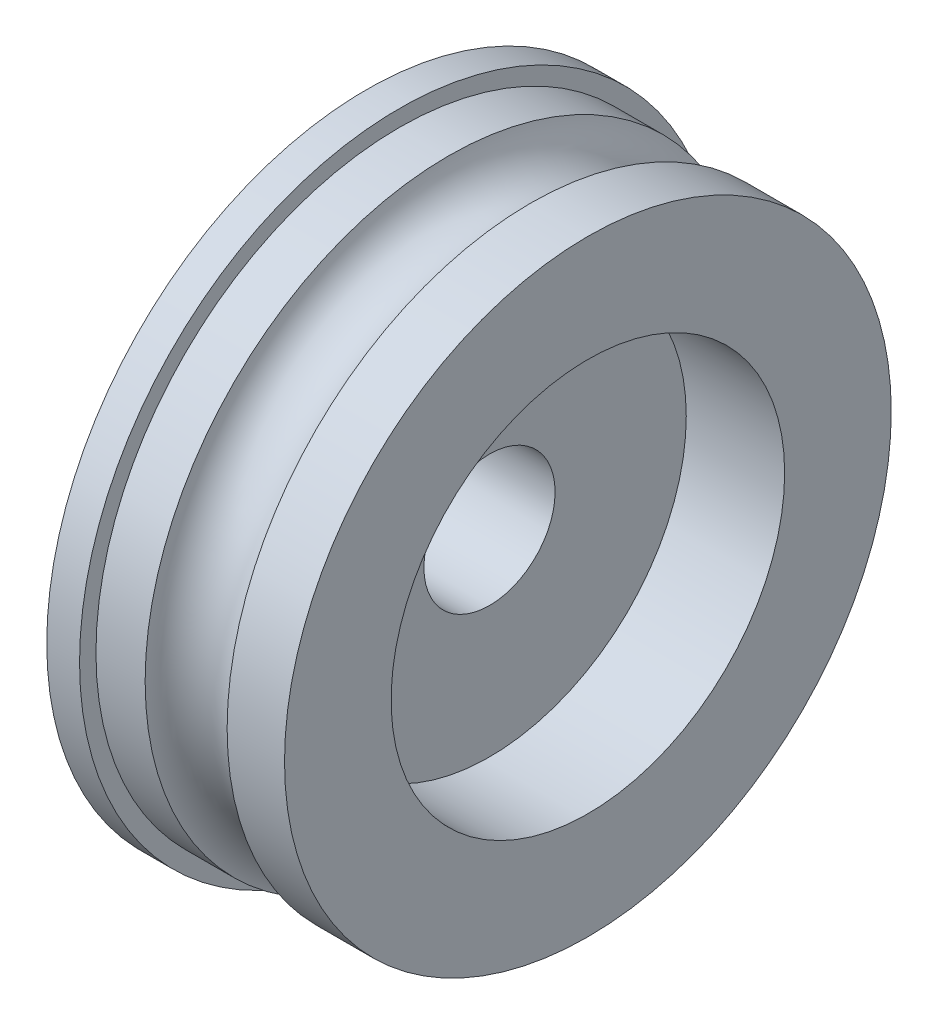
ISO-10303-21;
HEADER;
FILE_DESCRIPTION(('STEP AP214'),'2;1');
FILE_NAME('part.step','',(''),(''),'','','');
FILE_SCHEMA(('AUTOMOTIVE_DESIGN { 1 0 10303 214 1 1 1 1 }'));
ENDSEC;
DATA;
#1=APPLICATION_CONTEXT('core data for automotive mechanical design processes');
#2=APPLICATION_PROTOCOL_DEFINITION('international standard','automotive_design',2000,#1);
#3=PRODUCT_CONTEXT('',#1,'mechanical');
#4=PRODUCT('Part','Part','',(#3));
#5=PRODUCT_RELATED_PRODUCT_CATEGORY('part','',(#4));
#6=PRODUCT_DEFINITION_FORMATION('','',#4);
#7=PRODUCT_DEFINITION_CONTEXT('part definition',#1,'design');
#8=PRODUCT_DEFINITION('design','',#6,#7);
#9=PRODUCT_DEFINITION_SHAPE('','',#8);
#10=(LENGTH_UNIT() NAMED_UNIT(*) SI_UNIT(.MILLI.,.METRE.));
#11=(NAMED_UNIT(*) PLANE_ANGLE_UNIT() SI_UNIT($,.RADIAN.));
#12=(NAMED_UNIT(*) SI_UNIT($,.STERADIAN.) SOLID_ANGLE_UNIT());
#13=UNCERTAINTY_MEASURE_WITH_UNIT(LENGTH_MEASURE(1.E-05),#10,'distance_accuracy_value','');
#14=(GEOMETRIC_REPRESENTATION_CONTEXT(3) GLOBAL_UNCERTAINTY_ASSIGNED_CONTEXT((#13)) GLOBAL_UNIT_ASSIGNED_CONTEXT((#10,
#11,#12)) REPRESENTATION_CONTEXT('',''));
#15=CARTESIAN_POINT('',(0.,0.,0.));
#16=DIRECTION('',(0.,0.,1.));
#17=DIRECTION('',(1.,0.,0.));
#18=AXIS2_PLACEMENT_3D('',#15,#16,#17);
#19=CARTESIAN_POINT('',(-2.72805347180651,0.,0.));
#20=DIRECTION('',(-1.,0.,0.));
#21=DIRECTION('',(0.,0.,1.));
#22=AXIS2_PLACEMENT_3D('',#19,#20,#21);
#23=CYLINDRICAL_SURFACE('',#22,2.);
#24=CARTESIAN_POINT('',(-3.49037162162162,0.,0.));
#25=DIRECTION('',(-1.,0.,0.));
#26=DIRECTION('',(0.,0.,1.));
#27=AXIS2_PLACEMENT_3D('',#24,#25,#26);
#28=CIRCLE('',#27,2.);
#29=CARTESIAN_POINT('',(-3.49037162162162,0.,2.));
#30=VERTEX_POINT('',#29);
#31=EDGE_CURVE('E10',#30,#30,#28,.T.);
#32=ORIENTED_EDGE('',*,*,#31,.T.);
#33=EDGE_LOOP('',(#32));
#34=FACE_BOUND('',#33,.T.);
#35=CARTESIAN_POINT('',(0.259628378378379,0.,0.));
#36=DIRECTION('',(1.,0.,0.));
#37=DIRECTION('',(0.,0.,-1.));
#38=AXIS2_PLACEMENT_3D('',#35,#36,#37);
#39=CIRCLE('',#38,2.);
#40=CARTESIAN_POINT('',(0.259628378378379,0.,-2.));
#41=VERTEX_POINT('',#40);
#42=EDGE_CURVE('E35',#41,#41,#39,.F.);
#43=ORIENTED_EDGE('',*,*,#42,.F.);
#44=EDGE_LOOP('',(#43));
#45=FACE_BOUND('',#44,.T.);
#46=ADVANCED_FACE('F31',(#34,#45),#23,.F.);
#47=CARTESIAN_POINT('',(-3.49037162162162,0.,-2.));
#48=DIRECTION('',(1.,0.,0.));
#49=DIRECTION('',(0.,0.,-1.));
#50=AXIS2_PLACEMENT_3D('',#47,#48,#49);
#51=PLANE('',#50);
#52=ORIENTED_EDGE('',*,*,#31,.F.);
#53=EDGE_LOOP('',(#52));
#54=FACE_BOUND('',#53,.T.);
#55=CARTESIAN_POINT('',(-3.49037162162162,0.,0.));
#56=DIRECTION('',(-1.,0.,0.));
#57=DIRECTION('',(0.,0.,1.));
#58=AXIS2_PLACEMENT_3D('',#55,#56,#57);
#59=CIRCLE('',#58,9.75);
#60=CARTESIAN_POINT('',(-3.49037162162162,0.,9.75));
#61=VERTEX_POINT('',#60);
#62=EDGE_CURVE('E57',#61,#61,#59,.T.);
#63=ORIENTED_EDGE('',*,*,#62,.T.);
#64=EDGE_LOOP('',(#63));
#65=FACE_BOUND('',#64,.T.);
#66=ADVANCED_FACE('F33',(#54,#65),#51,.F.);
#67=CARTESIAN_POINT('',(3.25962837837838,0.,-9.25));
#68=DIRECTION('',(-1.,0.,0.));
#69=DIRECTION('',(0.,0.,1.));
#70=AXIS2_PLACEMENT_3D('',#67,#68,#69);
#71=PLANE('',#70);
#72=CARTESIAN_POINT('',(3.25962837837838,0.,0.));
#73=DIRECTION('',(1.,0.,0.));
#74=DIRECTION('',(0.,0.,-1.));
#75=AXIS2_PLACEMENT_3D('',#72,#73,#74);
#76=CIRCLE('',#75,6.);
#77=CARTESIAN_POINT('',(3.25962837837838,0.,-6.));
#78=VERTEX_POINT('',#77);
#79=EDGE_CURVE('E60',#78,#78,#76,.T.);
#80=ORIENTED_EDGE('',*,*,#79,.F.);
#81=EDGE_LOOP('',(#80));
#82=FACE_BOUND('',#81,.T.);
#83=CARTESIAN_POINT('',(3.25962837837838,0.,0.));
#84=DIRECTION('',(-1.,0.,0.));
#85=DIRECTION('',(0.,0.,1.));
#86=AXIS2_PLACEMENT_3D('',#83,#84,#85);
#87=CIRCLE('',#86,9.25);
#88=CARTESIAN_POINT('',(3.25962837837838,0.,9.25));
#89=VERTEX_POINT('',#88);
#90=EDGE_CURVE('E39',#89,#89,#87,.T.);
#91=ORIENTED_EDGE('',*,*,#90,.F.);
#92=EDGE_LOOP('',(#91));
#93=FACE_BOUND('',#92,.T.);
#94=ADVANCED_FACE('F76',(#82,#93),#71,.F.);
#95=CARTESIAN_POINT('',(-2.72805347180651,0.,0.));
#96=DIRECTION('',(-1.,0.,0.));
#97=DIRECTION('',(0.,0.,1.));
#98=AXIS2_PLACEMENT_3D('',#95,#96,#97);
#99=CYLINDRICAL_SURFACE('',#98,9.25);
#100=CARTESIAN_POINT('',(1.50962837837838,0.,0.));
#101=DIRECTION('',(-1.,0.,0.));
#102=DIRECTION('',(0.,0.,1.));
#103=AXIS2_PLACEMENT_3D('',#100,#101,#102);
#104=CIRCLE('',#103,9.25);
#105=CARTESIAN_POINT('',(1.50962837837838,0.,9.25));
#106=VERTEX_POINT('',#105);
#107=EDGE_CURVE('E43',#106,#106,#104,.T.);
#108=ORIENTED_EDGE('',*,*,#107,.F.);
#109=EDGE_LOOP('',(#108));
#110=FACE_BOUND('',#109,.T.);
#111=ORIENTED_EDGE('',*,*,#90,.T.);
#112=EDGE_LOOP('',(#111));
#113=FACE_BOUND('',#112,.T.);
#114=ADVANCED_FACE('F81',(#110,#113),#99,.T.);
#115=CARTESIAN_POINT('',(0.259628378378379,0.,0.));
#116=DIRECTION('',(-1.,0.,0.));
#117=DIRECTION('',(0.,0.,1.));
#118=AXIS2_PLACEMENT_3D('',#115,#116,#117);
#119=TOROIDAL_SURFACE('',#118,9.5,1.2747548783982);
#120=CARTESIAN_POINT('',(-0.990371621621622,0.,0.));
#121=DIRECTION('',(-1.,0.,0.));
#122=DIRECTION('',(0.,0.,1.));
#123=AXIS2_PLACEMENT_3D('',#120,#121,#122);
#124=CIRCLE('',#123,9.25);
#125=CARTESIAN_POINT('',(-0.990371621621622,0.,9.25));
#126=VERTEX_POINT('',#125);
#127=EDGE_CURVE('E48',#126,#126,#124,.T.);
#128=ORIENTED_EDGE('',*,*,#127,.F.);
#129=EDGE_LOOP('',(#128));
#130=FACE_BOUND('',#129,.T.);
#131=ORIENTED_EDGE('',*,*,#107,.T.);
#132=EDGE_LOOP('',(#131));
#133=FACE_BOUND('',#132,.T.);
#134=ADVANCED_FACE('F85',(#130,#133),#119,.F.);
#135=CARTESIAN_POINT('',(-2.72805347180651,0.,0.));
#136=DIRECTION('',(-1.,0.,0.));
#137=DIRECTION('',(0.,0.,1.));
#138=AXIS2_PLACEMENT_3D('',#135,#136,#137);
#139=CYLINDRICAL_SURFACE('',#138,9.25);
#140=CARTESIAN_POINT('',(-2.49037162162162,0.,0.));
#141=DIRECTION('',(-1.,0.,0.));
#142=DIRECTION('',(0.,0.,1.));
#143=AXIS2_PLACEMENT_3D('',#140,#141,#142);
#144=CIRCLE('',#143,9.25);
#145=CARTESIAN_POINT('',(-2.49037162162162,0.,9.25));
#146=VERTEX_POINT('',#145);
#147=EDGE_CURVE('E51',#146,#146,#144,.T.);
#148=ORIENTED_EDGE('',*,*,#147,.F.);
#149=EDGE_LOOP('',(#148));
#150=FACE_BOUND('',#149,.T.);
#151=ORIENTED_EDGE('',*,*,#127,.T.);
#152=EDGE_LOOP('',(#151));
#153=FACE_BOUND('',#152,.T.);
#154=ADVANCED_FACE('F89',(#150,#153),#139,.T.);
#155=CARTESIAN_POINT('',(-2.49037162162162,0.,-9.75));
#156=DIRECTION('',(-1.,0.,0.));
#157=DIRECTION('',(0.,0.,1.));
#158=AXIS2_PLACEMENT_3D('',#155,#156,#157);
#159=PLANE('',#158);
#160=CARTESIAN_POINT('',(-2.49037162162162,0.,0.));
#161=DIRECTION('',(-1.,0.,0.));
#162=DIRECTION('',(0.,0.,1.));
#163=AXIS2_PLACEMENT_3D('',#160,#161,#162);
#164=CIRCLE('',#163,9.75);
#165=CARTESIAN_POINT('',(-2.49037162162162,0.,9.75));
#166=VERTEX_POINT('',#165);
#167=EDGE_CURVE('E54',#166,#166,#164,.T.);
#168=ORIENTED_EDGE('',*,*,#167,.F.);
#169=EDGE_LOOP('',(#168));
#170=FACE_BOUND('',#169,.T.);
#171=ORIENTED_EDGE('',*,*,#147,.T.);
#172=EDGE_LOOP('',(#171));
#173=FACE_BOUND('',#172,.T.);
#174=ADVANCED_FACE('F93',(#170,#173),#159,.F.);
#175=CARTESIAN_POINT('',(-2.72805347180651,0.,0.));
#176=DIRECTION('',(-1.,0.,0.));
#177=DIRECTION('',(0.,0.,1.));
#178=AXIS2_PLACEMENT_3D('',#175,#176,#177);
#179=CYLINDRICAL_SURFACE('',#178,9.75);
#180=ORIENTED_EDGE('',*,*,#62,.F.);
#181=EDGE_LOOP('',(#180));
#182=FACE_BOUND('',#181,.T.);
#183=ORIENTED_EDGE('',*,*,#167,.T.);
#184=EDGE_LOOP('',(#183));
#185=FACE_BOUND('',#184,.T.);
#186=ADVANCED_FACE('F97',(#182,#185),#179,.T.);
#187=CARTESIAN_POINT('',(0.259628378378379,0.,0.));
#188=DIRECTION('',(1.,0.,0.));
#189=DIRECTION('',(0.,0.,-1.));
#190=AXIS2_PLACEMENT_3D('',#187,#188,#189);
#191=PLANE('',#190);
#192=CARTESIAN_POINT('',(0.259628378378379,0.,0.));
#193=DIRECTION('',(1.,0.,0.));
#194=DIRECTION('',(0.,0.,-1.));
#195=AXIS2_PLACEMENT_3D('',#192,#193,#194);
#196=CIRCLE('',#195,6.);
#197=CARTESIAN_POINT('',(0.259628378378379,0.,-6.));
#198=VERTEX_POINT('',#197);
#199=EDGE_CURVE('E63',#198,#198,#196,.T.);
#200=ORIENTED_EDGE('',*,*,#199,.T.);
#201=EDGE_LOOP('',(#200));
#202=FACE_BOUND('',#201,.T.);
#203=ORIENTED_EDGE('',*,*,#42,.T.);
#204=EDGE_LOOP('',(#203));
#205=FACE_BOUND('',#204,.T.);
#206=ADVANCED_FACE('F70',(#202,#205),#191,.T.);
#207=CARTESIAN_POINT('',(0.259628378378379,0.,0.));
#208=DIRECTION('',(1.,0.,0.));
#209=DIRECTION('',(0.,0.,-1.));
#210=AXIS2_PLACEMENT_3D('',#207,#208,#209);
#211=CYLINDRICAL_SURFACE('',#210,6.);
#212=ORIENTED_EDGE('',*,*,#199,.F.);
#213=EDGE_LOOP('',(#212));
#214=FACE_BOUND('',#213,.T.);
#215=ORIENTED_EDGE('',*,*,#79,.T.);
#216=EDGE_LOOP('',(#215));
#217=FACE_BOUND('',#216,.T.);
#218=ADVANCED_FACE('F102',(#214,#217),#211,.F.);
#219=CLOSED_SHELL('',(#46,#66,#94,#114,#134,#154,#174,#186,#206,#218));
#220=MANIFOLD_SOLID_BREP('B2',#219);
#221=ADVANCED_BREP_SHAPE_REPRESENTATION('',(#18,#220),#14);
#222=SHAPE_DEFINITION_REPRESENTATION(#9,#221);
ENDSEC;
END-ISO-10303-21;
